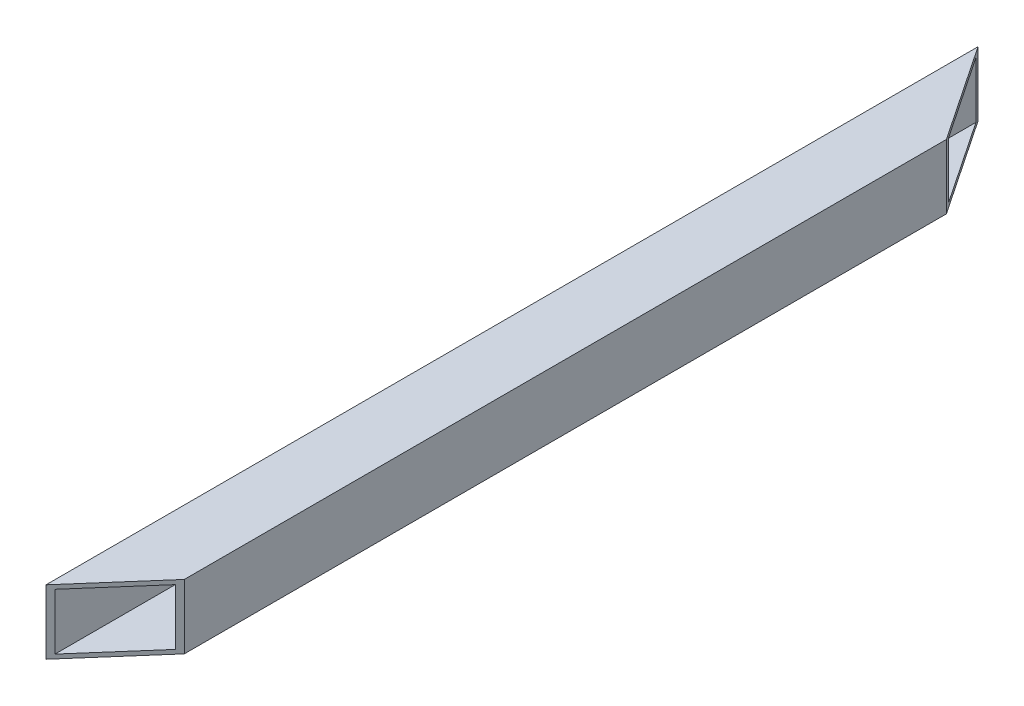
ISO-10303-21;
HEADER;
FILE_DESCRIPTION(('STEP AP214'),'2;1');
FILE_NAME('part.step','',(''),(''),'','','');
FILE_SCHEMA(('AUTOMOTIVE_DESIGN { 1 0 10303 214 1 1 1 1 }'));
ENDSEC;
DATA;
#1=APPLICATION_CONTEXT('core data for automotive mechanical design processes');
#2=APPLICATION_PROTOCOL_DEFINITION('international standard','automotive_design',2000,#1);
#3=PRODUCT_CONTEXT('',#1,'mechanical');
#4=PRODUCT('Part','Part','',(#3));
#5=PRODUCT_RELATED_PRODUCT_CATEGORY('part','',(#4));
#6=PRODUCT_DEFINITION_FORMATION('','',#4);
#7=PRODUCT_DEFINITION_CONTEXT('part definition',#1,'design');
#8=PRODUCT_DEFINITION('design','',#6,#7);
#9=PRODUCT_DEFINITION_SHAPE('','',#8);
#10=(LENGTH_UNIT() NAMED_UNIT(*) SI_UNIT(.MILLI.,.METRE.));
#11=(NAMED_UNIT(*) PLANE_ANGLE_UNIT() SI_UNIT($,.RADIAN.));
#12=(NAMED_UNIT(*) SI_UNIT($,.STERADIAN.) SOLID_ANGLE_UNIT());
#13=UNCERTAINTY_MEASURE_WITH_UNIT(LENGTH_MEASURE(1.E-05),#10,'distance_accuracy_value','');
#14=(GEOMETRIC_REPRESENTATION_CONTEXT(3) GLOBAL_UNCERTAINTY_ASSIGNED_CONTEXT((#13)) GLOBAL_UNIT_ASSIGNED_CONTEXT((#10,
#11,#12)) REPRESENTATION_CONTEXT('',''));
#15=CARTESIAN_POINT('',(0.,0.,0.));
#16=DIRECTION('',(0.,0.,1.));
#17=DIRECTION('',(1.,0.,0.));
#18=AXIS2_PLACEMENT_3D('',#15,#16,#17);
#19=CARTESIAN_POINT('',(0.,-354.6,367.12));
#20=DIRECTION('',(-0.753109895855482,0.,-0.657894736842107));
#21=DIRECTION('',(-0.657894736842107,0.,0.753109895855482));
#22=AXIS2_PLACEMENT_3D('',#19,#20,#21);
#23=PLANE('',#22);
#24=DIRECTION('',(0.,1.,0.));
#25=VECTOR('',#24,1.);
#26=CARTESIAN_POINT('',(25.4,-354.6,338.043933140812));
#27=LINE('',#26,#25);
#28=CARTESIAN_POINT('',(25.4,0.,338.043933140812));
#29=VERTEX_POINT('',#28);
#30=CARTESIAN_POINT('',(25.4,25.4,338.043933140812));
#31=VERTEX_POINT('',#30);
#32=EDGE_CURVE('E138',#29,#31,#27,.T.);
#33=ORIENTED_EDGE('',*,*,#32,.T.);
#34=DIRECTION('',(-0.657894736842107,0.,0.753109895855482));
#35=VECTOR('',#34,1.);
#36=CARTESIAN_POINT('',(0.,25.4,367.12));
#37=LINE('',#36,#35);
#38=CARTESIAN_POINT('',(0.,25.4,367.12));
#39=VERTEX_POINT('',#38);
#40=EDGE_CURVE('E136',#31,#39,#37,.T.);
#41=ORIENTED_EDGE('',*,*,#40,.T.);
#42=DIRECTION('',(0.,-1.,0.));
#43=VECTOR('',#42,1.);
#44=CARTESIAN_POINT('',(0.,0.,367.12));
#45=LINE('',#44,#43);
#46=CARTESIAN_POINT('',(0.,0.,367.12));
#47=VERTEX_POINT('',#46);
#48=EDGE_CURVE('E153',#39,#47,#45,.T.);
#49=ORIENTED_EDGE('',*,*,#48,.T.);
#50=DIRECTION('',(-0.657894736842107,0.,0.753109895855482));
#51=VECTOR('',#50,1.);
#52=CARTESIAN_POINT('',(0.,0.,367.12));
#53=LINE('',#52,#51);
#54=EDGE_CURVE('E140',#29,#47,#53,.T.);
#55=ORIENTED_EDGE('',*,*,#54,.F.);
#56=EDGE_LOOP('',(#33,#41,#49,#55));
#57=FACE_BOUND('',#56,.T.);
#58=DIRECTION('',(0.,1.,0.));
#59=VECTOR('',#58,1.);
#60=CARTESIAN_POINT('',(23.749,-354.6,339.933877486659));
#61=LINE('',#60,#59);
#62=CARTESIAN_POINT('',(23.749,1.651,339.933877486659));
#63=VERTEX_POINT('',#62);
#64=CARTESIAN_POINT('',(23.749,23.749,339.933877486659));
#65=VERTEX_POINT('',#64);
#66=EDGE_CURVE('E128',#63,#65,#61,.T.);
#67=ORIENTED_EDGE('',*,*,#66,.F.);
#68=DIRECTION('',(-0.657894736842107,0.,0.753109895855482));
#69=VECTOR('',#68,1.);
#70=CARTESIAN_POINT('',(0.,1.651,367.12));
#71=LINE('',#70,#69);
#72=CARTESIAN_POINT('',(1.651,1.651,365.230055654153));
#73=VERTEX_POINT('',#72);
#74=EDGE_CURVE('E124',#63,#73,#71,.T.);
#75=ORIENTED_EDGE('',*,*,#74,.T.);
#76=DIRECTION('',(0.,-1.,0.));
#77=VECTOR('',#76,1.);
#78=CARTESIAN_POINT('',(1.651,-354.6,365.230055654153));
#79=LINE('',#78,#77);
#80=CARTESIAN_POINT('',(1.651,23.749,365.230055654153));
#81=VERTEX_POINT('',#80);
#82=EDGE_CURVE('E110',#81,#73,#79,.T.);
#83=ORIENTED_EDGE('',*,*,#82,.F.);
#84=DIRECTION('',(-0.657894736842107,0.,0.753109895855482));
#85=VECTOR('',#84,1.);
#86=CARTESIAN_POINT('',(0.,23.749,367.12));
#87=LINE('',#86,#85);
#88=EDGE_CURVE('E119',#65,#81,#87,.T.);
#89=ORIENTED_EDGE('',*,*,#88,.F.);
#90=EDGE_LOOP('',(#67,#75,#83,#89));
#91=FACE_BOUND('',#90,.T.);
#92=ADVANCED_FACE('F36',(#57,#91),#23,.F.);
#93=CARTESIAN_POINT('',(0.,0.,367.12));
#94=DIRECTION('',(1.,0.,0.));
#95=DIRECTION('',(0.,0.,-1.));
#96=AXIS2_PLACEMENT_3D('',#93,#94,#95);
#97=PLANE('',#96);
#98=DIRECTION('',(0.,-1.,0.));
#99=VECTOR('',#98,1.);
#100=CARTESIAN_POINT('',(0.,0.,0.));
#101=LINE('',#100,#99);
#102=CARTESIAN_POINT('',(0.,25.4,0.));
#103=VERTEX_POINT('',#102);
#104=CARTESIAN_POINT('',(0.,0.,0.));
#105=VERTEX_POINT('',#104);
#106=EDGE_CURVE('E152',#103,#105,#101,.T.);
#107=ORIENTED_EDGE('',*,*,#106,.T.);
#108=DIRECTION('',(0.,0.,-1.));
#109=VECTOR('',#108,1.);
#110=CARTESIAN_POINT('',(0.,0.,367.12));
#111=LINE('',#110,#109);
#112=EDGE_CURVE('E11',#47,#105,#111,.T.);
#113=ORIENTED_EDGE('',*,*,#112,.F.);
#114=ORIENTED_EDGE('',*,*,#48,.F.);
#115=DIRECTION('',(0.,0.,-1.));
#116=VECTOR('',#115,1.);
#117=CARTESIAN_POINT('',(0.,25.4,367.12));
#118=LINE('',#117,#116);
#119=EDGE_CURVE('E155',#39,#103,#118,.T.);
#120=ORIENTED_EDGE('',*,*,#119,.T.);
#121=EDGE_LOOP('',(#107,#113,#114,#120));
#122=FACE_BOUND('',#121,.T.);
#123=ADVANCED_FACE('F38',(#122),#97,.F.);
#124=CARTESIAN_POINT('',(0.,0.,367.12));
#125=DIRECTION('',(0.,1.,0.));
#126=DIRECTION('',(0.,0.,1.));
#127=AXIS2_PLACEMENT_3D('',#124,#125,#126);
#128=PLANE('',#127);
#129=DIRECTION('',(0.,0.,-1.));
#130=VECTOR('',#129,1.);
#131=CARTESIAN_POINT('',(25.4,0.,367.12));
#132=LINE('',#131,#130);
#133=CARTESIAN_POINT('',(25.4,0.,37.8555510516805));
#134=VERTEX_POINT('',#133);
#135=EDGE_CURVE('E44',#29,#134,#132,.T.);
#136=ORIENTED_EDGE('',*,*,#135,.F.);
#137=ORIENTED_EDGE('',*,*,#54,.T.);
#138=ORIENTED_EDGE('',*,*,#112,.T.);
#139=DIRECTION('',(0.557172610873229,0.,0.830396701398018));
#140=VECTOR('',#139,1.);
#141=CARTESIAN_POINT('',(169.856988347273,0.,253.150783223027));
#142=LINE('',#141,#140);
#143=EDGE_CURVE('E149',#105,#134,#142,.T.);
#144=ORIENTED_EDGE('',*,*,#143,.T.);
#145=EDGE_LOOP('',(#136,#137,#138,#144));
#146=FACE_BOUND('',#145,.T.);
#147=ADVANCED_FACE('F169',(#146),#128,.F.);
#148=CARTESIAN_POINT('',(25.4,0.,367.12));
#149=DIRECTION('',(-1.,0.,0.));
#150=DIRECTION('',(0.,0.,1.));
#151=AXIS2_PLACEMENT_3D('',#148,#149,#150);
#152=PLANE('',#151);
#153=DIRECTION('',(0.,0.,-1.));
#154=VECTOR('',#153,1.);
#155=CARTESIAN_POINT('',(25.4,25.4,367.12));
#156=LINE('',#155,#154);
#157=CARTESIAN_POINT('',(25.4,25.4,37.8555510516805));
#158=VERTEX_POINT('',#157);
#159=EDGE_CURVE('E160',#31,#158,#156,.T.);
#160=ORIENTED_EDGE('',*,*,#159,.F.);
#161=ORIENTED_EDGE('',*,*,#32,.F.);
#162=ORIENTED_EDGE('',*,*,#135,.T.);
#163=DIRECTION('',(0.,1.,0.));
#164=VECTOR('',#163,1.);
#165=CARTESIAN_POINT('',(25.4,-354.6,37.8555510516805));
#166=LINE('',#165,#164);
#167=EDGE_CURVE('E146',#134,#158,#166,.T.);
#168=ORIENTED_EDGE('',*,*,#167,.T.);
#169=EDGE_LOOP('',(#160,#161,#162,#168));
#170=FACE_BOUND('',#169,.T.);
#171=ADVANCED_FACE('F166',(#170),#152,.F.);
#172=CARTESIAN_POINT('',(0.,25.4,367.12));
#173=DIRECTION('',(0.,-1.,0.));
#174=DIRECTION('',(0.,0.,-1.));
#175=AXIS2_PLACEMENT_3D('',#172,#173,#174);
#176=PLANE('',#175);
#177=ORIENTED_EDGE('',*,*,#119,.F.);
#178=ORIENTED_EDGE('',*,*,#40,.F.);
#179=ORIENTED_EDGE('',*,*,#159,.T.);
#180=DIRECTION('',(0.557172610873229,0.,0.830396701398018));
#181=VECTOR('',#180,1.);
#182=CARTESIAN_POINT('',(0.,25.4,0.));
#183=LINE('',#182,#181);
#184=EDGE_CURVE('E143',#103,#158,#183,.T.);
#185=ORIENTED_EDGE('',*,*,#184,.F.);
#186=EDGE_LOOP('',(#177,#178,#179,#185));
#187=FACE_BOUND('',#186,.T.);
#188=ADVANCED_FACE('F175',(#187),#176,.F.);
#189=CARTESIAN_POINT('',(0.,-354.6,0.));
#190=DIRECTION('',(-0.830396701398018,0.,0.557172610873229));
#191=DIRECTION('',(0.557172610873229,0.,0.830396701398018));
#192=AXIS2_PLACEMENT_3D('',#189,#190,#191);
#193=PLANE('',#192);
#194=DIRECTION('',(0.557172610873229,0.,0.830396701398018));
#195=VECTOR('',#194,1.);
#196=CARTESIAN_POINT('',(0.,23.749,0.));
#197=LINE('',#196,#195);
#198=CARTESIAN_POINT('',(1.651,23.749,2.46061081835924));
#199=VERTEX_POINT('',#198);
#200=CARTESIAN_POINT('',(23.749,23.749,35.3949402333213));
#201=VERTEX_POINT('',#200);
#202=EDGE_CURVE('E117',#199,#201,#197,.T.);
#203=ORIENTED_EDGE('',*,*,#202,.F.);
#204=DIRECTION('',(0.,-1.,0.));
#205=VECTOR('',#204,1.);
#206=CARTESIAN_POINT('',(1.651,0.,2.46061081835924));
#207=LINE('',#206,#205);
#208=CARTESIAN_POINT('',(1.651,1.651,2.46061081835924));
#209=VERTEX_POINT('',#208);
#210=EDGE_CURVE('E102',#199,#209,#207,.T.);
#211=ORIENTED_EDGE('',*,*,#210,.T.);
#212=DIRECTION('',(0.557172610873229,0.,0.830396701398018));
#213=VECTOR('',#212,1.);
#214=CARTESIAN_POINT('',(169.856988347273,1.651,253.150783223027));
#215=LINE('',#214,#213);
#216=CARTESIAN_POINT('',(23.749,1.651,35.3949402333213));
#217=VERTEX_POINT('',#216);
#218=EDGE_CURVE('E111',#209,#217,#215,.T.);
#219=ORIENTED_EDGE('',*,*,#218,.T.);
#220=DIRECTION('',(0.,1.,0.));
#221=VECTOR('',#220,1.);
#222=CARTESIAN_POINT('',(23.749,0.,35.3949402333213));
#223=LINE('',#222,#221);
#224=EDGE_CURVE('E51',#217,#201,#223,.T.);
#225=ORIENTED_EDGE('',*,*,#224,.T.);
#226=EDGE_LOOP('',(#203,#211,#219,#225));
#227=FACE_BOUND('',#226,.T.);
#228=ORIENTED_EDGE('',*,*,#106,.F.);
#229=ORIENTED_EDGE('',*,*,#184,.T.);
#230=ORIENTED_EDGE('',*,*,#167,.F.);
#231=ORIENTED_EDGE('',*,*,#143,.F.);
#232=EDGE_LOOP('',(#228,#229,#230,#231));
#233=FACE_BOUND('',#232,.T.);
#234=ADVANCED_FACE('F122',(#227,#233),#193,.F.);
#235=CARTESIAN_POINT('',(1.651,0.,367.12));
#236=DIRECTION('',(1.,0.,0.));
#237=DIRECTION('',(0.,0.,-1.));
#238=AXIS2_PLACEMENT_3D('',#235,#236,#237);
#239=PLANE('',#238);
#240=ORIENTED_EDGE('',*,*,#210,.F.);
#241=DIRECTION('',(0.,0.,-1.));
#242=VECTOR('',#241,1.);
#243=CARTESIAN_POINT('',(1.651,23.749,367.12));
#244=LINE('',#243,#242);
#245=EDGE_CURVE('E105',#81,#199,#244,.T.);
#246=ORIENTED_EDGE('',*,*,#245,.F.);
#247=ORIENTED_EDGE('',*,*,#82,.T.);
#248=DIRECTION('',(0.,0.,-1.));
#249=VECTOR('',#248,1.);
#250=CARTESIAN_POINT('',(1.651,1.651,367.12));
#251=LINE('',#250,#249);
#252=EDGE_CURVE('E59',#73,#209,#251,.T.);
#253=ORIENTED_EDGE('',*,*,#252,.T.);
#254=EDGE_LOOP('',(#240,#246,#247,#253));
#255=FACE_BOUND('',#254,.T.);
#256=ADVANCED_FACE('F104',(#255),#239,.T.);
#257=CARTESIAN_POINT('',(0.,1.651,367.12));
#258=DIRECTION('',(0.,1.,0.));
#259=DIRECTION('',(0.,0.,1.));
#260=AXIS2_PLACEMENT_3D('',#257,#258,#259);
#261=PLANE('',#260);
#262=DIRECTION('',(0.,0.,-1.));
#263=VECTOR('',#262,1.);
#264=CARTESIAN_POINT('',(23.749,1.651,367.12));
#265=LINE('',#264,#263);
#266=EDGE_CURVE('E183',#63,#217,#265,.T.);
#267=ORIENTED_EDGE('',*,*,#266,.T.);
#268=ORIENTED_EDGE('',*,*,#218,.F.);
#269=ORIENTED_EDGE('',*,*,#252,.F.);
#270=ORIENTED_EDGE('',*,*,#74,.F.);
#271=EDGE_LOOP('',(#267,#268,#269,#270));
#272=FACE_BOUND('',#271,.T.);
#273=ADVANCED_FACE('F186',(#272),#261,.T.);
#274=CARTESIAN_POINT('',(23.749,0.,367.12));
#275=DIRECTION('',(-1.,0.,0.));
#276=DIRECTION('',(0.,0.,1.));
#277=AXIS2_PLACEMENT_3D('',#274,#275,#276);
#278=PLANE('',#277);
#279=DIRECTION('',(0.,0.,-1.));
#280=VECTOR('',#279,1.);
#281=CARTESIAN_POINT('',(23.749,23.749,367.12));
#282=LINE('',#281,#280);
#283=EDGE_CURVE('E120',#65,#201,#282,.T.);
#284=ORIENTED_EDGE('',*,*,#283,.T.);
#285=ORIENTED_EDGE('',*,*,#224,.F.);
#286=ORIENTED_EDGE('',*,*,#266,.F.);
#287=ORIENTED_EDGE('',*,*,#66,.T.);
#288=EDGE_LOOP('',(#284,#285,#286,#287));
#289=FACE_BOUND('',#288,.T.);
#290=ADVANCED_FACE('F182',(#289),#278,.T.);
#291=CARTESIAN_POINT('',(0.,23.749,367.12));
#292=DIRECTION('',(0.,-1.,0.));
#293=DIRECTION('',(0.,0.,-1.));
#294=AXIS2_PLACEMENT_3D('',#291,#292,#293);
#295=PLANE('',#294);
#296=ORIENTED_EDGE('',*,*,#245,.T.);
#297=ORIENTED_EDGE('',*,*,#202,.T.);
#298=ORIENTED_EDGE('',*,*,#283,.F.);
#299=ORIENTED_EDGE('',*,*,#88,.T.);
#300=EDGE_LOOP('',(#296,#297,#298,#299));
#301=FACE_BOUND('',#300,.T.);
#302=ADVANCED_FACE('F115',(#301),#295,.T.);
#303=CLOSED_SHELL('',(#92,#123,#147,#171,#188,#234,#256,#273,#290,#302));
#304=MANIFOLD_SOLID_BREP('B2',#303);
#305=ADVANCED_BREP_SHAPE_REPRESENTATION('',(#18,#304),#14);
#306=SHAPE_DEFINITION_REPRESENTATION(#9,#305);
ENDSEC;
END-ISO-10303-21;
